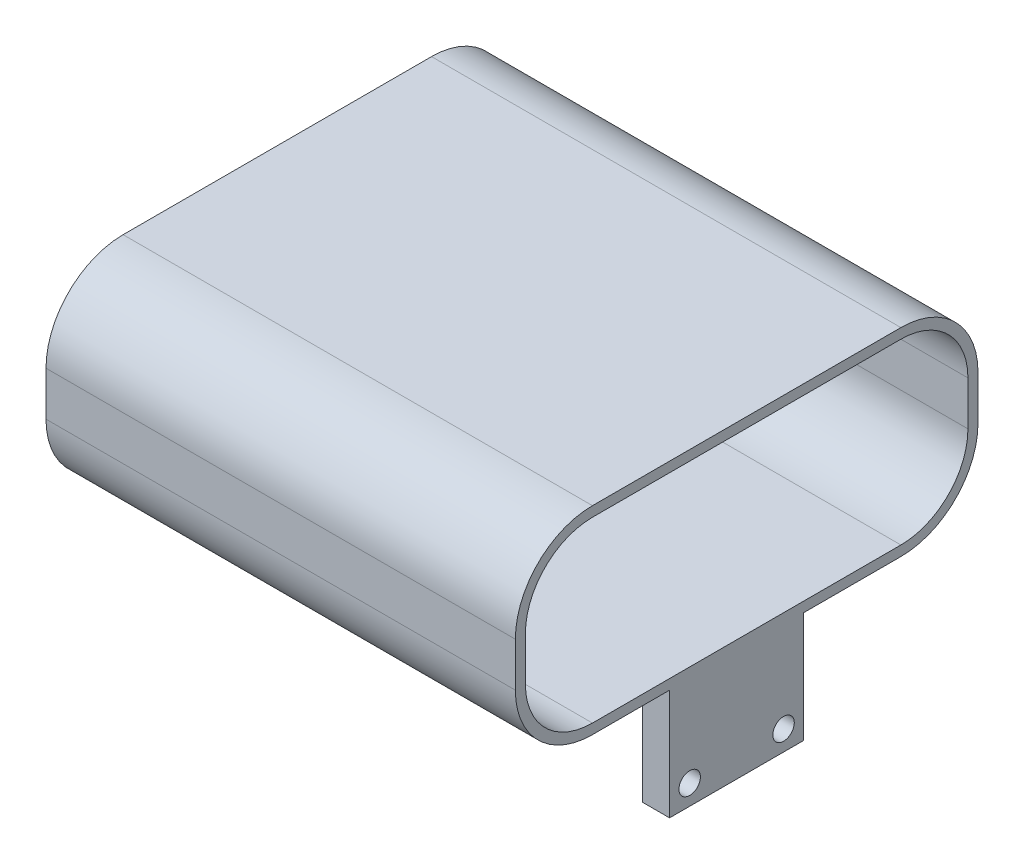
ISO-10303-21;
HEADER;
FILE_DESCRIPTION(('STEP AP214'),'2;1');
FILE_NAME('part.step','',(''),(''),'','','');
FILE_SCHEMA(('AUTOMOTIVE_DESIGN { 1 0 10303 214 1 1 1 1 }'));
ENDSEC;
DATA;
#1=APPLICATION_CONTEXT('core data for automotive mechanical design processes');
#2=APPLICATION_PROTOCOL_DEFINITION('international standard','automotive_design',2000,#1);
#3=PRODUCT_CONTEXT('',#1,'mechanical');
#4=PRODUCT('Part','Part','',(#3));
#5=PRODUCT_RELATED_PRODUCT_CATEGORY('part','',(#4));
#6=PRODUCT_DEFINITION_FORMATION('','',#4);
#7=PRODUCT_DEFINITION_CONTEXT('part definition',#1,'design');
#8=PRODUCT_DEFINITION('design','',#6,#7);
#9=PRODUCT_DEFINITION_SHAPE('','',#8);
#10=(LENGTH_UNIT() NAMED_UNIT(*) SI_UNIT(.MILLI.,.METRE.));
#11=(NAMED_UNIT(*) PLANE_ANGLE_UNIT() SI_UNIT($,.RADIAN.));
#12=(NAMED_UNIT(*) SI_UNIT($,.STERADIAN.) SOLID_ANGLE_UNIT());
#13=UNCERTAINTY_MEASURE_WITH_UNIT(LENGTH_MEASURE(1.E-05),#10,'distance_accuracy_value','');
#14=(GEOMETRIC_REPRESENTATION_CONTEXT(3) GLOBAL_UNCERTAINTY_ASSIGNED_CONTEXT((#13)) GLOBAL_UNIT_ASSIGNED_CONTEXT((#10,
#11,#12)) REPRESENTATION_CONTEXT('',''));
#15=CARTESIAN_POINT('',(0.,0.,0.));
#16=DIRECTION('',(0.,0.,1.));
#17=DIRECTION('',(1.,0.,0.));
#18=AXIS2_PLACEMENT_3D('',#15,#16,#17);
#19=CARTESIAN_POINT('',(35.,7.29134190104978,-22.2726300602498));
#20=DIRECTION('',(-1.,0.,0.));
#21=DIRECTION('',(0.,0.,1.));
#22=AXIS2_PLACEMENT_3D('',#19,#20,#21);
#23=CYLINDRICAL_SURFACE('',#22,11.5);
#24=CARTESIAN_POINT('',(-5.00000000000002,7.29134190104978,-22.2726300602498));
#25=DIRECTION('',(1.,0.,0.));
#26=DIRECTION('',(0.,1.,0.));
#27=AXIS2_PLACEMENT_3D('',#24,#25,#26);
#28=CIRCLE('',#27,11.5);
#29=CARTESIAN_POINT('',(-5.00000000000002,7.29134190104987,-33.7726300602498));
#30=VERTEX_POINT('',#29);
#31=CARTESIAN_POINT('',(-5.00000000000002,-4.20865809895022,-22.2726300602498));
#32=VERTEX_POINT('',#31);
#33=EDGE_CURVE('E224',#30,#32,#28,.F.);
#34=ORIENTED_EDGE('',*,*,#33,.F.);
#35=DIRECTION('',(-1.,0.,0.));
#36=VECTOR('',#35,1.);
#37=CARTESIAN_POINT('',(35.,7.29134190104987,-33.7726300602498));
#38=LINE('',#37,#36);
#39=CARTESIAN_POINT('',(35.,7.29134190104987,-33.7726300602498));
#40=VERTEX_POINT('',#39);
#41=EDGE_CURVE('E232',#40,#30,#38,.T.);
#42=ORIENTED_EDGE('',*,*,#41,.F.);
#43=CARTESIAN_POINT('',(35.,7.29134190104978,-22.2726300602498));
#44=DIRECTION('',(-1.,0.,0.));
#45=DIRECTION('',(0.,0.,1.));
#46=AXIS2_PLACEMENT_3D('',#43,#44,#45);
#47=CIRCLE('',#46,11.5);
#48=CARTESIAN_POINT('',(35.,-4.20865809895022,-22.2726300602497));
#49=VERTEX_POINT('',#48);
#50=EDGE_CURVE('E417',#40,#49,#47,.T.);
#51=ORIENTED_EDGE('',*,*,#50,.T.);
#52=DIRECTION('',(-1.,0.,0.));
#53=VECTOR('',#52,1.);
#54=CARTESIAN_POINT('',(35.,-4.20865809895022,-22.2726300602497));
#55=LINE('',#54,#53);
#56=EDGE_CURVE('E231',#49,#32,#55,.T.);
#57=ORIENTED_EDGE('',*,*,#56,.T.);
#58=EDGE_LOOP('',(#34,#42,#51,#57));
#59=FACE_BOUND('',#58,.T.);
#60=ADVANCED_FACE('F41',(#59),#23,.T.);
#61=CARTESIAN_POINT('',(35.,25.3699847558208,0.));
#62=DIRECTION('',(0.,-1.,0.));
#63=DIRECTION('',(0.,0.,-1.));
#64=AXIS2_PLACEMENT_3D('',#61,#62,#63);
#65=PLANE('',#64);
#66=DIRECTION('',(0.,0.,1.));
#67=VECTOR('',#66,1.);
#68=CARTESIAN_POINT('',(-35.,25.3699847558208,0.));
#69=LINE('',#68,#67);
#70=CARTESIAN_POINT('',(-35.,25.3699847558208,-22.2726300602497));
#71=VERTEX_POINT('',#70);
#72=CARTESIAN_POINT('',(-35.,25.3699847558208,23.7273699397503));
#73=VERTEX_POINT('',#72);
#74=EDGE_CURVE('E278',#71,#73,#69,.T.);
#75=ORIENTED_EDGE('',*,*,#74,.T.);
#76=DIRECTION('',(-1.,0.,0.));
#77=VECTOR('',#76,1.);
#78=CARTESIAN_POINT('',(35.,25.3699847558208,23.7273699397502));
#79=LINE('',#78,#77);
#80=CARTESIAN_POINT('',(35.,25.3699847558208,23.7273699397502));
#81=VERTEX_POINT('',#80);
#82=EDGE_CURVE('E49',#81,#73,#79,.T.);
#83=ORIENTED_EDGE('',*,*,#82,.F.);
#84=DIRECTION('',(0.,0.,1.));
#85=VECTOR('',#84,1.);
#86=CARTESIAN_POINT('',(35.,25.3699847558208,0.));
#87=LINE('',#86,#85);
#88=CARTESIAN_POINT('',(35.,25.3699847558208,-22.2726300602497));
#89=VERTEX_POINT('',#88);
#90=EDGE_CURVE('E410',#89,#81,#87,.T.);
#91=ORIENTED_EDGE('',*,*,#90,.F.);
#92=DIRECTION('',(-1.,0.,0.));
#93=VECTOR('',#92,1.);
#94=CARTESIAN_POINT('',(35.,25.3699847558208,-22.2726300602497));
#95=LINE('',#94,#93);
#96=EDGE_CURVE('E242',#89,#71,#95,.T.);
#97=ORIENTED_EDGE('',*,*,#96,.T.);
#98=EDGE_LOOP('',(#75,#83,#91,#97));
#99=FACE_BOUND('',#98,.T.);
#100=ADVANCED_FACE('F431',(#99),#65,.F.);
#101=CARTESIAN_POINT('',(35.,13.8699847558208,23.7273699397502));
#102=DIRECTION('',(-1.,0.,0.));
#103=DIRECTION('',(0.,0.,1.));
#104=AXIS2_PLACEMENT_3D('',#101,#102,#103);
#105=CYLINDRICAL_SURFACE('',#104,11.5);
#106=CARTESIAN_POINT('',(-35.,13.8699847558208,23.7273699397503));
#107=DIRECTION('',(-1.,0.,0.));
#108=DIRECTION('',(0.,0.,1.));
#109=AXIS2_PLACEMENT_3D('',#106,#107,#108);
#110=CIRCLE('',#109,11.5);
#111=CARTESIAN_POINT('',(-35.,13.8699847558208,35.2273699397503));
#112=VERTEX_POINT('',#111);
#113=EDGE_CURVE('E297',#73,#112,#110,.F.);
#114=ORIENTED_EDGE('',*,*,#113,.T.);
#115=DIRECTION('',(-1.,0.,0.));
#116=VECTOR('',#115,1.);
#117=CARTESIAN_POINT('',(35.,13.8699847558208,35.2273699397502));
#118=LINE('',#117,#116);
#119=CARTESIAN_POINT('',(35.,13.8699847558208,35.2273699397502));
#120=VERTEX_POINT('',#119);
#121=EDGE_CURVE('E302',#120,#112,#118,.T.);
#122=ORIENTED_EDGE('',*,*,#121,.F.);
#123=CARTESIAN_POINT('',(35.,13.8699847558208,23.7273699397502));
#124=DIRECTION('',(-1.,0.,0.));
#125=DIRECTION('',(0.,0.,1.));
#126=AXIS2_PLACEMENT_3D('',#123,#124,#125);
#127=CIRCLE('',#126,11.5);
#128=EDGE_CURVE('E265',#81,#120,#127,.F.);
#129=ORIENTED_EDGE('',*,*,#128,.F.);
#130=ORIENTED_EDGE('',*,*,#82,.T.);
#131=EDGE_LOOP('',(#114,#122,#129,#130));
#132=FACE_BOUND('',#131,.T.);
#133=ADVANCED_FACE('F428',(#132),#105,.T.);
#134=CARTESIAN_POINT('',(35.,0.,35.2273699397503));
#135=DIRECTION('',(0.,0.,-1.));
#136=DIRECTION('',(0.,1.,0.));
#137=AXIS2_PLACEMENT_3D('',#134,#135,#136);
#138=PLANE('',#137);
#139=DIRECTION('',(0.,-1.,0.));
#140=VECTOR('',#139,1.);
#141=CARTESIAN_POINT('',(-35.,0.,35.2273699397503));
#142=LINE('',#141,#140);
#143=CARTESIAN_POINT('',(-35.,7.29134190104978,35.2273699397503));
#144=VERTEX_POINT('',#143);
#145=EDGE_CURVE('E294',#112,#144,#142,.T.);
#146=ORIENTED_EDGE('',*,*,#145,.T.);
#147=DIRECTION('',(-1.,0.,0.));
#148=VECTOR('',#147,1.);
#149=CARTESIAN_POINT('',(35.,7.29134190104978,35.2273699397502));
#150=LINE('',#149,#148);
#151=CARTESIAN_POINT('',(35.,7.29134190104978,35.2273699397502));
#152=VERTEX_POINT('',#151);
#153=EDGE_CURVE('E304',#152,#144,#150,.T.);
#154=ORIENTED_EDGE('',*,*,#153,.F.);
#155=DIRECTION('',(0.,-1.,0.));
#156=VECTOR('',#155,1.);
#157=CARTESIAN_POINT('',(35.,0.,35.2273699397503));
#158=LINE('',#157,#156);
#159=EDGE_CURVE('E269',#120,#152,#158,.T.);
#160=ORIENTED_EDGE('',*,*,#159,.F.);
#161=ORIENTED_EDGE('',*,*,#121,.T.);
#162=EDGE_LOOP('',(#146,#154,#160,#161));
#163=FACE_BOUND('',#162,.T.);
#164=ADVANCED_FACE('F425',(#163),#138,.F.);
#165=CARTESIAN_POINT('',(35.,7.29134190104978,23.7273699397502));
#166=DIRECTION('',(-1.,0.,0.));
#167=DIRECTION('',(0.,0.,1.));
#168=AXIS2_PLACEMENT_3D('',#165,#166,#167);
#169=CYLINDRICAL_SURFACE('',#168,11.5);
#170=CARTESIAN_POINT('',(-35.,7.29134190104978,23.7273699397503));
#171=DIRECTION('',(-1.,0.,0.));
#172=DIRECTION('',(0.,0.,1.));
#173=AXIS2_PLACEMENT_3D('',#170,#171,#172);
#174=CIRCLE('',#173,11.5);
#175=CARTESIAN_POINT('',(-35.,-4.20865809895022,23.7273699397503));
#176=VERTEX_POINT('',#175);
#177=EDGE_CURVE('E291',#176,#144,#174,.T.);
#178=ORIENTED_EDGE('',*,*,#177,.F.);
#179=DIRECTION('',(-1.,0.,0.));
#180=VECTOR('',#179,1.);
#181=CARTESIAN_POINT('',(35.,-4.20865809895022,23.7273699397502));
#182=LINE('',#181,#180);
#183=CARTESIAN_POINT('',(35.,-4.20865809895022,23.7273699397502));
#184=VERTEX_POINT('',#183);
#185=EDGE_CURVE('E234',#184,#176,#182,.T.);
#186=ORIENTED_EDGE('',*,*,#185,.F.);
#187=CARTESIAN_POINT('',(35.,7.29134190104978,23.7273699397502));
#188=DIRECTION('',(-1.,0.,0.));
#189=DIRECTION('',(0.,0.,1.));
#190=AXIS2_PLACEMENT_3D('',#187,#188,#189);
#191=CIRCLE('',#190,11.5);
#192=EDGE_CURVE('E274',#184,#152,#191,.T.);
#193=ORIENTED_EDGE('',*,*,#192,.T.);
#194=ORIENTED_EDGE('',*,*,#153,.T.);
#195=EDGE_LOOP('',(#178,#186,#193,#194));
#196=FACE_BOUND('',#195,.T.);
#197=ADVANCED_FACE('F313',(#196),#169,.T.);
#198=CARTESIAN_POINT('',(35.,-4.20865809895022,0.));
#199=DIRECTION('',(0.,-1.,0.));
#200=DIRECTION('',(0.,0.,-1.));
#201=AXIS2_PLACEMENT_3D('',#198,#199,#200);
#202=PLANE('',#201);
#203=DIRECTION('',(1.,0.,0.));
#204=VECTOR('',#203,1.);
#205=CARTESIAN_POINT('',(35.,-4.20865809895022,-7.77263006024976));
#206=LINE('',#205,#204);
#207=CARTESIAN_POINT('',(31.,-4.20865809895022,-7.77263006024977));
#208=VERTEX_POINT('',#207);
#209=CARTESIAN_POINT('',(35.,-4.20865809895022,-7.77263006024976));
#210=VERTEX_POINT('',#209);
#211=EDGE_CURVE('E64',#208,#210,#206,.T.);
#212=ORIENTED_EDGE('',*,*,#211,.F.);
#213=DIRECTION('',(0.,0.,-1.));
#214=VECTOR('',#213,1.);
#215=CARTESIAN_POINT('',(31.,-4.20865809895022,0.));
#216=LINE('',#215,#214);
#217=CARTESIAN_POINT('',(31.,-4.20865809895022,12.2273699397502));
#218=VERTEX_POINT('',#217);
#219=EDGE_CURVE('E373',#218,#208,#216,.T.);
#220=ORIENTED_EDGE('',*,*,#219,.F.);
#221=DIRECTION('',(-1.,0.,0.));
#222=VECTOR('',#221,1.);
#223=CARTESIAN_POINT('',(35.,-4.20865809895022,12.2273699397502));
#224=LINE('',#223,#222);
#225=CARTESIAN_POINT('',(35.,-4.20865809895022,12.2273699397502));
#226=VERTEX_POINT('',#225);
#227=EDGE_CURVE('E367',#226,#218,#224,.T.);
#228=ORIENTED_EDGE('',*,*,#227,.F.);
#229=DIRECTION('',(0.,0.,1.));
#230=VECTOR('',#229,1.);
#231=CARTESIAN_POINT('',(35.,-4.20865809895022,0.));
#232=LINE('',#231,#230);
#233=EDGE_CURVE('E311',#226,#184,#232,.T.);
#234=ORIENTED_EDGE('',*,*,#233,.T.);
#235=ORIENTED_EDGE('',*,*,#185,.T.);
#236=DIRECTION('',(0.,0.,1.));
#237=VECTOR('',#236,1.);
#238=CARTESIAN_POINT('',(-35.,-4.20865809895022,0.));
#239=LINE('',#238,#237);
#240=CARTESIAN_POINT('',(-35.,-4.20865809895022,-22.2726300602497));
#241=VERTEX_POINT('',#240);
#242=EDGE_CURVE('E229',#241,#176,#239,.T.);
#243=ORIENTED_EDGE('',*,*,#242,.F.);
#244=CARTESIAN_POINT('',(-33.,-4.20865809895022,-22.2726300602497));
#245=VERTEX_POINT('',#244);
#246=EDGE_CURVE('E220',#245,#241,#55,.T.);
#247=ORIENTED_EDGE('',*,*,#246,.F.);
#248=DIRECTION('',(1.,0.,0.));
#249=VECTOR('',#248,1.);
#250=CARTESIAN_POINT('',(0.,-4.20865809895022,-22.2726300602498));
#251=LINE('',#250,#249);
#252=EDGE_CURVE('E197',#245,#32,#251,.T.);
#253=ORIENTED_EDGE('',*,*,#252,.T.);
#254=ORIENTED_EDGE('',*,*,#56,.F.);
#255=EDGE_CURVE('E420',#49,#210,#232,.T.);
#256=ORIENTED_EDGE('',*,*,#255,.T.);
#257=EDGE_LOOP('',(#212,#220,#228,#234,#235,#243,#247,#253,#254,#256));
#258=FACE_BOUND('',#257,.T.);
#259=ADVANCED_FACE('F227',(#258),#202,.T.);
#260=CARTESIAN_POINT('',(-33.,7.29134190104978,-22.2726300602497));
#261=DIRECTION('',(-1.,0.,0.));
#262=DIRECTION('',(0.,0.,1.));
#263=AXIS2_PLACEMENT_3D('',#260,#261,#262);
#264=CIRCLE('',#263,11.5);
#265=CARTESIAN_POINT('',(-33.,7.29134190104987,-33.7726300602497));
#266=VERTEX_POINT('',#265);
#267=EDGE_CURVE('E212',#245,#266,#264,.F.);
#268=ORIENTED_EDGE('',*,*,#267,.F.);
#269=ORIENTED_EDGE('',*,*,#246,.T.);
#270=CARTESIAN_POINT('',(-35.,7.29134190104978,-22.2726300602497));
#271=DIRECTION('',(-1.,0.,0.));
#272=DIRECTION('',(0.,0.,1.));
#273=AXIS2_PLACEMENT_3D('',#270,#271,#272);
#274=CIRCLE('',#273,11.5);
#275=CARTESIAN_POINT('',(-35.,7.29134190104987,-33.7726300602497));
#276=VERTEX_POINT('',#275);
#277=EDGE_CURVE('E288',#276,#241,#274,.T.);
#278=ORIENTED_EDGE('',*,*,#277,.F.);
#279=EDGE_CURVE('E222',#266,#276,#38,.T.);
#280=ORIENTED_EDGE('',*,*,#279,.F.);
#281=EDGE_LOOP('',(#268,#269,#278,#280));
#282=FACE_BOUND('',#281,.T.);
#283=ADVANCED_FACE('F218',(#282),#23,.T.);
#284=CARTESIAN_POINT('',(35.,0.,-33.7726300602498));
#285=DIRECTION('',(0.,0.,-1.));
#286=DIRECTION('',(-1.,0.,0.));
#287=AXIS2_PLACEMENT_3D('',#284,#285,#286);
#288=PLANE('',#287);
#289=DIRECTION('',(0.,-1.,0.));
#290=VECTOR('',#289,1.);
#291=CARTESIAN_POINT('',(-35.,0.,-33.7726300602497));
#292=LINE('',#291,#290);
#293=CARTESIAN_POINT('',(-35.,13.8699847558208,-33.7726300602497));
#294=VERTEX_POINT('',#293);
#295=EDGE_CURVE('E285',#294,#276,#292,.T.);
#296=ORIENTED_EDGE('',*,*,#295,.F.);
#297=DIRECTION('',(-1.,0.,0.));
#298=VECTOR('',#297,1.);
#299=CARTESIAN_POINT('',(35.,13.8699847558208,-33.7726300602498));
#300=LINE('',#299,#298);
#301=CARTESIAN_POINT('',(35.,13.8699847558208,-33.7726300602498));
#302=VERTEX_POINT('',#301);
#303=EDGE_CURVE('E240',#302,#294,#300,.T.);
#304=ORIENTED_EDGE('',*,*,#303,.F.);
#305=DIRECTION('',(0.,-1.,0.));
#306=VECTOR('',#305,1.);
#307=CARTESIAN_POINT('',(35.,0.,-33.7726300602498));
#308=LINE('',#307,#306);
#309=EDGE_CURVE('E415',#302,#40,#308,.T.);
#310=ORIENTED_EDGE('',*,*,#309,.T.);
#311=ORIENTED_EDGE('',*,*,#41,.T.);
#312=DIRECTION('',(-1.,0.,0.));
#313=VECTOR('',#312,1.);
#314=CARTESIAN_POINT('',(0.,7.29134190104987,-33.7726300602498));
#315=LINE('',#314,#313);
#316=EDGE_CURVE('E206',#30,#266,#315,.T.);
#317=ORIENTED_EDGE('',*,*,#316,.T.);
#318=ORIENTED_EDGE('',*,*,#279,.T.);
#319=EDGE_LOOP('',(#296,#304,#310,#311,#317,#318));
#320=FACE_BOUND('',#319,.T.);
#321=ADVANCED_FACE('F321',(#320),#288,.T.);
#322=CARTESIAN_POINT('',(35.,13.8699847558208,-22.2726300602498));
#323=DIRECTION('',(-1.,0.,0.));
#324=DIRECTION('',(0.,0.,1.));
#325=AXIS2_PLACEMENT_3D('',#322,#323,#324);
#326=CYLINDRICAL_SURFACE('',#325,10.);
#327=DIRECTION('',(-1.,0.,0.));
#328=VECTOR('',#327,1.);
#329=CARTESIAN_POINT('',(35.,23.8699847558208,-22.2726300602497));
#330=LINE('',#329,#328);
#331=CARTESIAN_POINT('',(35.,23.8699847558208,-22.2726300602497));
#332=VERTEX_POINT('',#331);
#333=CARTESIAN_POINT('',(-33.,23.8699847558208,-22.2726300602497));
#334=VERTEX_POINT('',#333);
#335=EDGE_CURVE('E263',#332,#334,#330,.T.);
#336=ORIENTED_EDGE('',*,*,#335,.T.);
#337=CARTESIAN_POINT('',(-33.,13.8699847558208,-22.2726300602497));
#338=DIRECTION('',(-1.,0.,0.));
#339=DIRECTION('',(0.,0.,1.));
#340=AXIS2_PLACEMENT_3D('',#337,#338,#339);
#341=CIRCLE('',#340,10.);
#342=CARTESIAN_POINT('',(-33.,13.8699847558208,-32.2726300602497));
#343=VERTEX_POINT('',#342);
#344=EDGE_CURVE('E282',#334,#343,#341,.T.);
#345=ORIENTED_EDGE('',*,*,#344,.T.);
#346=DIRECTION('',(-1.,0.,0.));
#347=VECTOR('',#346,1.);
#348=CARTESIAN_POINT('',(35.,13.8699847558208,-32.2726300602498));
#349=LINE('',#348,#347);
#350=CARTESIAN_POINT('',(35.,13.8699847558208,-32.2726300602498));
#351=VERTEX_POINT('',#350);
#352=EDGE_CURVE('E244',#351,#343,#349,.T.);
#353=ORIENTED_EDGE('',*,*,#352,.F.);
#354=CARTESIAN_POINT('',(35.,13.8699847558208,-22.2726300602498));
#355=DIRECTION('',(-1.,0.,0.));
#356=DIRECTION('',(0.,0.,1.));
#357=AXIS2_PLACEMENT_3D('',#354,#355,#356);
#358=CIRCLE('',#357,10.);
#359=EDGE_CURVE('E299',#332,#351,#358,.T.);
#360=ORIENTED_EDGE('',*,*,#359,.F.);
#361=EDGE_LOOP('',(#336,#345,#353,#360));
#362=FACE_BOUND('',#361,.T.);
#363=ADVANCED_FACE('F43',(#362),#326,.F.);
#364=CARTESIAN_POINT('',(35.,0.,-32.2726300602498));
#365=DIRECTION('',(0.,0.,-1.));
#366=DIRECTION('',(-1.,0.,0.));
#367=AXIS2_PLACEMENT_3D('',#364,#365,#366);
#368=PLANE('',#367);
#369=ORIENTED_EDGE('',*,*,#352,.T.);
#370=DIRECTION('',(0.,-1.,0.));
#371=VECTOR('',#370,1.);
#372=CARTESIAN_POINT('',(-33.,13.8699847558208,-32.2726300602497));
#373=LINE('',#372,#371);
#374=CARTESIAN_POINT('',(-33.,7.29134190104987,-32.2726300602497));
#375=VERTEX_POINT('',#374);
#376=EDGE_CURVE('E387',#343,#375,#373,.T.);
#377=ORIENTED_EDGE('',*,*,#376,.T.);
#378=DIRECTION('',(-1.,0.,0.));
#379=VECTOR('',#378,1.);
#380=CARTESIAN_POINT('',(35.,7.29134190104987,-32.2726300602498));
#381=LINE('',#380,#379);
#382=CARTESIAN_POINT('',(-5.00000000000002,7.29134190104987,-32.2726300602497));
#383=VERTEX_POINT('',#382);
#384=EDGE_CURVE('E225',#383,#375,#381,.T.);
#385=ORIENTED_EDGE('',*,*,#384,.F.);
#386=DIRECTION('',(-1.,0.,0.));
#387=VECTOR('',#386,1.);
#388=CARTESIAN_POINT('',(35.,7.29134190104985,-32.2726300602498));
#389=LINE('',#388,#387);
#390=CARTESIAN_POINT('',(35.,7.29134190104985,-32.2726300602498));
#391=VERTEX_POINT('',#390);
#392=EDGE_CURVE('E247',#391,#383,#389,.T.);
#393=ORIENTED_EDGE('',*,*,#392,.F.);
#394=DIRECTION('',(0.,-1.,0.));
#395=VECTOR('',#394,1.);
#396=CARTESIAN_POINT('',(35.,0.,-32.2726300602498));
#397=LINE('',#396,#395);
#398=EDGE_CURVE('E408',#351,#391,#397,.T.);
#399=ORIENTED_EDGE('',*,*,#398,.F.);
#400=EDGE_LOOP('',(#369,#377,#385,#393,#399));
#401=FACE_BOUND('',#400,.T.);
#402=ADVANCED_FACE('F444',(#401),#368,.F.);
#403=CARTESIAN_POINT('',(35.,7.29134190104978,-22.2726300602498));
#404=DIRECTION('',(-1.,0.,0.));
#405=DIRECTION('',(0.,0.,1.));
#406=AXIS2_PLACEMENT_3D('',#403,#404,#405);
#407=CYLINDRICAL_SURFACE('',#406,10.);
#408=ORIENTED_EDGE('',*,*,#392,.T.);
#409=CARTESIAN_POINT('',(-5.00000000000002,7.29134190104978,-22.2726300602498));
#410=DIRECTION('',(1.,0.,0.));
#411=DIRECTION('',(0.,1.,0.));
#412=AXIS2_PLACEMENT_3D('',#409,#410,#411);
#413=CIRCLE('',#412,10.);
#414=CARTESIAN_POINT('',(-5.00000000000002,-2.70865809895022,-22.2726300602498));
#415=VERTEX_POINT('',#414);
#416=EDGE_CURVE('E11',#383,#415,#413,.F.);
#417=ORIENTED_EDGE('',*,*,#416,.T.);
#418=DIRECTION('',(-1.,0.,0.));
#419=VECTOR('',#418,1.);
#420=CARTESIAN_POINT('',(35.,-2.70865809895022,-22.2726300602497));
#421=LINE('',#420,#419);
#422=CARTESIAN_POINT('',(35.,-2.70865809895022,-22.2726300602497));
#423=VERTEX_POINT('',#422);
#424=EDGE_CURVE('E250',#423,#415,#421,.T.);
#425=ORIENTED_EDGE('',*,*,#424,.F.);
#426=CARTESIAN_POINT('',(35.,7.29134190104978,-22.2726300602498));
#427=DIRECTION('',(-1.,0.,0.));
#428=DIRECTION('',(0.,0.,1.));
#429=AXIS2_PLACEMENT_3D('',#426,#427,#428);
#430=CIRCLE('',#429,10.);
#431=EDGE_CURVE('E406',#391,#423,#430,.T.);
#432=ORIENTED_EDGE('',*,*,#431,.F.);
#433=EDGE_LOOP('',(#408,#417,#425,#432));
#434=FACE_BOUND('',#433,.T.);
#435=ADVANCED_FACE('F448',(#434),#407,.F.);
#436=CARTESIAN_POINT('',(35.,-2.70865809895022,0.));
#437=DIRECTION('',(0.,-1.,0.));
#438=DIRECTION('',(0.,0.,-1.));
#439=AXIS2_PLACEMENT_3D('',#436,#437,#438);
#440=PLANE('',#439);
#441=DIRECTION('',(-1.,0.,0.));
#442=VECTOR('',#441,1.);
#443=CARTESIAN_POINT('',(35.,-2.70865809895022,23.7273699397502));
#444=LINE('',#443,#442);
#445=CARTESIAN_POINT('',(35.,-2.70865809895022,23.7273699397502));
#446=VERTEX_POINT('',#445);
#447=CARTESIAN_POINT('',(-33.,-2.70865809895022,23.7273699397503));
#448=VERTEX_POINT('',#447);
#449=EDGE_CURVE('E253',#446,#448,#444,.T.);
#450=ORIENTED_EDGE('',*,*,#449,.F.);
#451=DIRECTION('',(0.,0.,1.));
#452=VECTOR('',#451,1.);
#453=CARTESIAN_POINT('',(35.,-2.70865809895022,0.));
#454=LINE('',#453,#452);
#455=EDGE_CURVE('E404',#423,#446,#454,.T.);
#456=ORIENTED_EDGE('',*,*,#455,.F.);
#457=ORIENTED_EDGE('',*,*,#424,.T.);
#458=DIRECTION('',(1.,0.,0.));
#459=VECTOR('',#458,1.);
#460=CARTESIAN_POINT('',(35.,-2.70865809895022,-22.2726300602498));
#461=LINE('',#460,#459);
#462=CARTESIAN_POINT('',(-33.,-2.70865809895022,-22.2726300602497));
#463=VERTEX_POINT('',#462);
#464=EDGE_CURVE('E331',#463,#415,#461,.T.);
#465=ORIENTED_EDGE('',*,*,#464,.F.);
#466=DIRECTION('',(0.,0.,1.));
#467=VECTOR('',#466,1.);
#468=CARTESIAN_POINT('',(-33.,-2.70865809895022,-22.2726300602497));
#469=LINE('',#468,#467);
#470=EDGE_CURVE('E215',#463,#448,#469,.T.);
#471=ORIENTED_EDGE('',*,*,#470,.T.);
#472=EDGE_LOOP('',(#450,#456,#457,#465,#471));
#473=FACE_BOUND('',#472,.T.);
#474=ADVANCED_FACE('F541',(#473),#440,.F.);
#475=CARTESIAN_POINT('',(35.,7.29134190104978,23.7273699397502));
#476=DIRECTION('',(-1.,0.,0.));
#477=DIRECTION('',(0.,0.,1.));
#478=AXIS2_PLACEMENT_3D('',#475,#476,#477);
#479=CYLINDRICAL_SURFACE('',#478,10.);
#480=ORIENTED_EDGE('',*,*,#449,.T.);
#481=CARTESIAN_POINT('',(-33.,7.29134190104978,23.7273699397503));
#482=DIRECTION('',(-1.,0.,0.));
#483=DIRECTION('',(0.,0.,1.));
#484=AXIS2_PLACEMENT_3D('',#481,#482,#483);
#485=CIRCLE('',#484,10.);
#486=CARTESIAN_POINT('',(-33.,7.29134190104978,33.7273699397503));
#487=VERTEX_POINT('',#486);
#488=EDGE_CURVE('E384',#448,#487,#485,.T.);
#489=ORIENTED_EDGE('',*,*,#488,.T.);
#490=DIRECTION('',(-1.,0.,0.));
#491=VECTOR('',#490,1.);
#492=CARTESIAN_POINT('',(35.,7.29134190104978,33.7273699397502));
#493=LINE('',#492,#491);
#494=CARTESIAN_POINT('',(35.,7.29134190104978,33.7273699397502));
#495=VERTEX_POINT('',#494);
#496=EDGE_CURVE('E256',#495,#487,#493,.T.);
#497=ORIENTED_EDGE('',*,*,#496,.F.);
#498=CARTESIAN_POINT('',(35.,7.29134190104978,23.7273699397502));
#499=DIRECTION('',(-1.,0.,0.));
#500=DIRECTION('',(0.,0.,1.));
#501=AXIS2_PLACEMENT_3D('',#498,#499,#500);
#502=CIRCLE('',#501,10.);
#503=EDGE_CURVE('E402',#446,#495,#502,.T.);
#504=ORIENTED_EDGE('',*,*,#503,.F.);
#505=EDGE_LOOP('',(#480,#489,#497,#504));
#506=FACE_BOUND('',#505,.T.);
#507=ADVANCED_FACE('F545',(#506),#479,.F.);
#508=CARTESIAN_POINT('',(35.,0.,33.7273699397502));
#509=DIRECTION('',(0.,0.,-1.));
#510=DIRECTION('',(-1.,0.,0.));
#511=AXIS2_PLACEMENT_3D('',#508,#509,#510);
#512=PLANE('',#511);
#513=DIRECTION('',(0.,-1.,0.));
#514=VECTOR('',#513,1.);
#515=CARTESIAN_POINT('',(-33.,13.8699847558208,33.7273699397503));
#516=LINE('',#515,#514);
#517=CARTESIAN_POINT('',(-33.,13.8699847558208,33.7273699397503));
#518=VERTEX_POINT('',#517);
#519=EDGE_CURVE('E381',#518,#487,#516,.T.);
#520=ORIENTED_EDGE('',*,*,#519,.F.);
#521=DIRECTION('',(-1.,0.,0.));
#522=VECTOR('',#521,1.);
#523=CARTESIAN_POINT('',(35.,13.8699847558208,33.7273699397502));
#524=LINE('',#523,#522);
#525=CARTESIAN_POINT('',(35.,13.8699847558208,33.7273699397502));
#526=VERTEX_POINT('',#525);
#527=EDGE_CURVE('E259',#526,#518,#524,.T.);
#528=ORIENTED_EDGE('',*,*,#527,.F.);
#529=DIRECTION('',(0.,-1.,0.));
#530=VECTOR('',#529,1.);
#531=CARTESIAN_POINT('',(35.,0.,33.7273699397502));
#532=LINE('',#531,#530);
#533=EDGE_CURVE('E399',#526,#495,#532,.T.);
#534=ORIENTED_EDGE('',*,*,#533,.T.);
#535=ORIENTED_EDGE('',*,*,#496,.T.);
#536=EDGE_LOOP('',(#520,#528,#534,#535));
#537=FACE_BOUND('',#536,.T.);
#538=ADVANCED_FACE('F582',(#537),#512,.T.);
#539=CARTESIAN_POINT('',(35.,13.8699847558208,23.7273699397502));
#540=DIRECTION('',(-1.,0.,0.));
#541=DIRECTION('',(0.,0.,1.));
#542=AXIS2_PLACEMENT_3D('',#539,#540,#541);
#543=CYLINDRICAL_SURFACE('',#542,10.);
#544=CARTESIAN_POINT('',(-33.,13.8699847558208,23.7273699397503));
#545=DIRECTION('',(1.,0.,0.));
#546=DIRECTION('',(0.,0.,-1.));
#547=AXIS2_PLACEMENT_3D('',#544,#545,#546);
#548=CIRCLE('',#547,10.);
#549=CARTESIAN_POINT('',(-33.,23.8699847558208,23.7273699397503));
#550=VERTEX_POINT('',#549);
#551=EDGE_CURVE('E378',#550,#518,#548,.T.);
#552=ORIENTED_EDGE('',*,*,#551,.F.);
#553=DIRECTION('',(-1.,0.,0.));
#554=VECTOR('',#553,1.);
#555=CARTESIAN_POINT('',(35.,23.8699847558208,23.7273699397502));
#556=LINE('',#555,#554);
#557=CARTESIAN_POINT('',(35.,23.8699847558208,23.7273699397502));
#558=VERTEX_POINT('',#557);
#559=EDGE_CURVE('E262',#558,#550,#556,.T.);
#560=ORIENTED_EDGE('',*,*,#559,.F.);
#561=CARTESIAN_POINT('',(35.,13.8699847558208,23.7273699397502));
#562=DIRECTION('',(-1.,0.,0.));
#563=DIRECTION('',(0.,0.,1.));
#564=AXIS2_PLACEMENT_3D('',#561,#562,#563);
#565=CIRCLE('',#564,10.);
#566=EDGE_CURVE('E396',#558,#526,#565,.F.);
#567=ORIENTED_EDGE('',*,*,#566,.T.);
#568=ORIENTED_EDGE('',*,*,#527,.T.);
#569=EDGE_LOOP('',(#552,#560,#567,#568));
#570=FACE_BOUND('',#569,.T.);
#571=ADVANCED_FACE('F591',(#570),#543,.F.);
#572=CARTESIAN_POINT('',(35.,23.8699847558208,0.));
#573=DIRECTION('',(0.,-1.,0.));
#574=DIRECTION('',(0.,0.,-1.));
#575=AXIS2_PLACEMENT_3D('',#572,#573,#574);
#576=PLANE('',#575);
#577=DIRECTION('',(0.,0.,1.));
#578=VECTOR('',#577,1.);
#579=CARTESIAN_POINT('',(-33.,23.8699847558208,-22.2726300602497));
#580=LINE('',#579,#578);
#581=EDGE_CURVE('E375',#334,#550,#580,.T.);
#582=ORIENTED_EDGE('',*,*,#581,.F.);
#583=ORIENTED_EDGE('',*,*,#335,.F.);
#584=DIRECTION('',(0.,0.,1.));
#585=VECTOR('',#584,1.);
#586=CARTESIAN_POINT('',(35.,23.8699847558208,0.));
#587=LINE('',#586,#585);
#588=EDGE_CURVE('E393',#332,#558,#587,.T.);
#589=ORIENTED_EDGE('',*,*,#588,.T.);
#590=ORIENTED_EDGE('',*,*,#559,.T.);
#591=EDGE_LOOP('',(#582,#583,#589,#590));
#592=FACE_BOUND('',#591,.T.);
#593=ADVANCED_FACE('F600',(#592),#576,.T.);
#594=CARTESIAN_POINT('',(35.,13.8699847558208,-22.2726300602498));
#595=DIRECTION('',(-1.,0.,0.));
#596=DIRECTION('',(0.,0.,1.));
#597=AXIS2_PLACEMENT_3D('',#594,#595,#596);
#598=CYLINDRICAL_SURFACE('',#597,11.5);
#599=CARTESIAN_POINT('',(-35.,13.8699847558208,-22.2726300602497));
#600=DIRECTION('',(-1.,0.,0.));
#601=DIRECTION('',(0.,0.,1.));
#602=AXIS2_PLACEMENT_3D('',#599,#600,#601);
#603=CIRCLE('',#602,11.5);
#604=EDGE_CURVE('E281',#71,#294,#603,.T.);
#605=ORIENTED_EDGE('',*,*,#604,.F.);
#606=ORIENTED_EDGE('',*,*,#96,.F.);
#607=CARTESIAN_POINT('',(35.,13.8699847558208,-22.2726300602498));
#608=DIRECTION('',(-1.,0.,0.));
#609=DIRECTION('',(0.,0.,1.));
#610=AXIS2_PLACEMENT_3D('',#607,#608,#609);
#611=CIRCLE('',#610,11.5);
#612=EDGE_CURVE('E412',#89,#302,#611,.T.);
#613=ORIENTED_EDGE('',*,*,#612,.T.);
#614=ORIENTED_EDGE('',*,*,#303,.T.);
#615=EDGE_LOOP('',(#605,#606,#613,#614));
#616=FACE_BOUND('',#615,.T.);
#617=ADVANCED_FACE('F434',(#616),#598,.T.);
#618=CARTESIAN_POINT('',(35.,0.,0.));
#619=DIRECTION('',(-1.,0.,0.));
#620=DIRECTION('',(0.,0.,1.));
#621=AXIS2_PLACEMENT_3D('',#618,#619,#620);
#622=PLANE('',#621);
#623=ORIENTED_EDGE('',*,*,#233,.F.);
#624=DIRECTION('',(0.,-1.,0.));
#625=VECTOR('',#624,1.);
#626=CARTESIAN_POINT('',(35.,-2.70865809895022,12.2273699397502));
#627=LINE('',#626,#625);
#628=CARTESIAN_POINT('',(35.,-20.7086580989501,12.2273699397502));
#629=VERTEX_POINT('',#628);
#630=EDGE_CURVE('E361',#226,#629,#627,.T.);
#631=ORIENTED_EDGE('',*,*,#630,.T.);
#632=DIRECTION('',(0.,0.,-1.));
#633=VECTOR('',#632,1.);
#634=CARTESIAN_POINT('',(35.,-20.7086580989501,-7.77263006024977));
#635=LINE('',#634,#633);
#636=CARTESIAN_POINT('',(35.,-20.7086580989501,-7.77263006024977));
#637=VERTEX_POINT('',#636);
#638=EDGE_CURVE('E353',#629,#637,#635,.T.);
#639=ORIENTED_EDGE('',*,*,#638,.T.);
#640=DIRECTION('',(0.,1.,0.));
#641=VECTOR('',#640,1.);
#642=CARTESIAN_POINT('',(35.,-2.70865809895022,-7.77263006024976));
#643=LINE('',#642,#641);
#644=EDGE_CURVE('E346',#637,#210,#643,.T.);
#645=ORIENTED_EDGE('',*,*,#644,.T.);
#646=ORIENTED_EDGE('',*,*,#255,.F.);
#647=ORIENTED_EDGE('',*,*,#50,.F.);
#648=ORIENTED_EDGE('',*,*,#309,.F.);
#649=ORIENTED_EDGE('',*,*,#612,.F.);
#650=ORIENTED_EDGE('',*,*,#90,.T.);
#651=ORIENTED_EDGE('',*,*,#128,.T.);
#652=ORIENTED_EDGE('',*,*,#159,.T.);
#653=ORIENTED_EDGE('',*,*,#192,.F.);
#654=EDGE_LOOP('',(#623,#631,#639,#645,#646,#647,#648,#649,#650,#651,#652,#653));
#655=FACE_BOUND('',#654,.T.);
#656=ORIENTED_EDGE('',*,*,#455,.T.);
#657=ORIENTED_EDGE('',*,*,#503,.T.);
#658=ORIENTED_EDGE('',*,*,#533,.F.);
#659=ORIENTED_EDGE('',*,*,#566,.F.);
#660=ORIENTED_EDGE('',*,*,#588,.F.);
#661=ORIENTED_EDGE('',*,*,#359,.T.);
#662=ORIENTED_EDGE('',*,*,#398,.T.);
#663=ORIENTED_EDGE('',*,*,#431,.T.);
#664=EDGE_LOOP('',(#656,#657,#658,#659,#660,#661,#662,#663));
#665=FACE_BOUND('',#664,.T.);
#666=CARTESIAN_POINT('',(35.,-17.7086580989501,9.22736993975023));
#667=DIRECTION('',(1.,0.,0.));
#668=DIRECTION('',(0.,0.,-1.));
#669=AXIS2_PLACEMENT_3D('',#666,#667,#668);
#670=CIRCLE('',#669,1.6);
#671=CARTESIAN_POINT('',(35.,-17.7086580989501,7.62736993975023));
#672=VERTEX_POINT('',#671);
#673=EDGE_CURVE('E336',#672,#672,#670,.T.);
#674=ORIENTED_EDGE('',*,*,#673,.F.);
#675=EDGE_LOOP('',(#674));
#676=FACE_BOUND('',#675,.T.);
#677=CARTESIAN_POINT('',(35.,-17.7086580989501,-4.77263006024977));
#678=DIRECTION('',(1.,0.,0.));
#679=DIRECTION('',(0.,0.,-1.));
#680=AXIS2_PLACEMENT_3D('',#677,#678,#679);
#681=CIRCLE('',#680,1.6);
#682=CARTESIAN_POINT('',(35.,-17.7086580989501,-6.37263006024977));
#683=VERTEX_POINT('',#682);
#684=EDGE_CURVE('E340',#683,#683,#681,.T.);
#685=ORIENTED_EDGE('',*,*,#684,.F.);
#686=EDGE_LOOP('',(#685));
#687=FACE_BOUND('',#686,.T.);
#688=ADVANCED_FACE('F421',(#655,#665,#676,#687),#622,.F.);
#689=CARTESIAN_POINT('',(-35.,0.,0.));
#690=DIRECTION('',(-1.,0.,0.));
#691=DIRECTION('',(0.,0.,1.));
#692=AXIS2_PLACEMENT_3D('',#689,#690,#691);
#693=PLANE('',#692);
#694=ORIENTED_EDGE('',*,*,#74,.F.);
#695=ORIENTED_EDGE('',*,*,#604,.T.);
#696=ORIENTED_EDGE('',*,*,#295,.T.);
#697=ORIENTED_EDGE('',*,*,#277,.T.);
#698=ORIENTED_EDGE('',*,*,#242,.T.);
#699=ORIENTED_EDGE('',*,*,#177,.T.);
#700=ORIENTED_EDGE('',*,*,#145,.F.);
#701=ORIENTED_EDGE('',*,*,#113,.F.);
#702=EDGE_LOOP('',(#694,#695,#696,#697,#698,#699,#700,#701));
#703=FACE_BOUND('',#702,.T.);
#704=ADVANCED_FACE('F317',(#703),#693,.T.);
#705=CARTESIAN_POINT('',(-33.,13.8699847558208,23.7273699397503));
#706=DIRECTION('',(1.,0.,0.));
#707=DIRECTION('',(0.,0.,-1.));
#708=AXIS2_PLACEMENT_3D('',#705,#706,#707);
#709=PLANE('',#708);
#710=ORIENTED_EDGE('',*,*,#470,.F.);
#711=DIRECTION('',(0.,1.,0.));
#712=VECTOR('',#711,1.);
#713=CARTESIAN_POINT('',(-33.,0.,-22.2726300602497));
#714=LINE('',#713,#712);
#715=EDGE_CURVE('E200',#245,#463,#714,.T.);
#716=ORIENTED_EDGE('',*,*,#715,.F.);
#717=ORIENTED_EDGE('',*,*,#267,.T.);
#718=DIRECTION('',(0.,0.,-1.));
#719=VECTOR('',#718,1.);
#720=CARTESIAN_POINT('',(-33.,7.29134190104987,-22.2726300602497));
#721=LINE('',#720,#719);
#722=EDGE_CURVE('E56',#375,#266,#721,.T.);
#723=ORIENTED_EDGE('',*,*,#722,.F.);
#724=ORIENTED_EDGE('',*,*,#376,.F.);
#725=ORIENTED_EDGE('',*,*,#344,.F.);
#726=ORIENTED_EDGE('',*,*,#581,.T.);
#727=ORIENTED_EDGE('',*,*,#551,.T.);
#728=ORIENTED_EDGE('',*,*,#519,.T.);
#729=ORIENTED_EDGE('',*,*,#488,.F.);
#730=EDGE_LOOP('',(#710,#716,#717,#723,#724,#725,#726,#727,#728,#729));
#731=FACE_BOUND('',#730,.T.);
#732=ADVANCED_FACE('F211',(#731),#709,.T.);
#733=CARTESIAN_POINT('',(31.,-2.70865809895022,-7.77263006024976));
#734=DIRECTION('',(0.,0.,-1.));
#735=DIRECTION('',(-1.,0.,0.));
#736=AXIS2_PLACEMENT_3D('',#733,#734,#735);
#737=PLANE('',#736);
#738=DIRECTION('',(0.,1.,0.));
#739=VECTOR('',#738,1.);
#740=CARTESIAN_POINT('',(31.,-2.70865809895022,-7.77263006024976));
#741=LINE('',#740,#739);
#742=CARTESIAN_POINT('',(31.,-20.7086580989501,-7.77263006024977));
#743=VERTEX_POINT('',#742);
#744=EDGE_CURVE('E349',#743,#208,#741,.T.);
#745=ORIENTED_EDGE('',*,*,#744,.T.);
#746=ORIENTED_EDGE('',*,*,#211,.T.);
#747=ORIENTED_EDGE('',*,*,#644,.F.);
#748=DIRECTION('',(1.,0.,0.));
#749=VECTOR('',#748,1.);
#750=CARTESIAN_POINT('',(31.,-20.7086580989501,-7.77263006024977));
#751=LINE('',#750,#749);
#752=EDGE_CURVE('E365',#743,#637,#751,.T.);
#753=ORIENTED_EDGE('',*,*,#752,.F.);
#754=EDGE_LOOP('',(#745,#746,#747,#753));
#755=FACE_BOUND('',#754,.T.);
#756=ADVANCED_FACE('F491',(#755),#737,.T.);
#757=CARTESIAN_POINT('',(31.,-20.7086580989501,-7.77263006024977));
#758=DIRECTION('',(0.,-1.,0.));
#759=DIRECTION('',(0.,0.,-1.));
#760=AXIS2_PLACEMENT_3D('',#757,#758,#759);
#761=PLANE('',#760);
#762=ORIENTED_EDGE('',*,*,#638,.F.);
#763=DIRECTION('',(1.,0.,0.));
#764=VECTOR('',#763,1.);
#765=CARTESIAN_POINT('',(31.,-20.7086580989501,12.2273699397502));
#766=LINE('',#765,#764);
#767=CARTESIAN_POINT('',(31.,-20.7086580989501,12.2273699397502));
#768=VERTEX_POINT('',#767);
#769=EDGE_CURVE('E358',#768,#629,#766,.T.);
#770=ORIENTED_EDGE('',*,*,#769,.F.);
#771=DIRECTION('',(0.,0.,-1.));
#772=VECTOR('',#771,1.);
#773=CARTESIAN_POINT('',(31.,-20.7086580989501,-7.77263006024977));
#774=LINE('',#773,#772);
#775=EDGE_CURVE('E355',#768,#743,#774,.T.);
#776=ORIENTED_EDGE('',*,*,#775,.T.);
#777=ORIENTED_EDGE('',*,*,#752,.T.);
#778=EDGE_LOOP('',(#762,#770,#776,#777));
#779=FACE_BOUND('',#778,.T.);
#780=ADVANCED_FACE('F494',(#779),#761,.T.);
#781=CARTESIAN_POINT('',(31.,-2.70865809895022,12.2273699397502));
#782=DIRECTION('',(0.,0.,1.));
#783=DIRECTION('',(1.,0.,0.));
#784=AXIS2_PLACEMENT_3D('',#781,#782,#783);
#785=PLANE('',#784);
#786=ORIENTED_EDGE('',*,*,#630,.F.);
#787=ORIENTED_EDGE('',*,*,#227,.T.);
#788=DIRECTION('',(0.,-1.,0.));
#789=VECTOR('',#788,1.);
#790=CARTESIAN_POINT('',(31.,-2.70865809895022,12.2273699397502));
#791=LINE('',#790,#789);
#792=EDGE_CURVE('E352',#218,#768,#791,.T.);
#793=ORIENTED_EDGE('',*,*,#792,.T.);
#794=ORIENTED_EDGE('',*,*,#769,.T.);
#795=EDGE_LOOP('',(#786,#787,#793,#794));
#796=FACE_BOUND('',#795,.T.);
#797=ADVANCED_FACE('F496',(#796),#785,.T.);
#798=CARTESIAN_POINT('',(31.,0.,0.));
#799=DIRECTION('',(-1.,0.,0.));
#800=DIRECTION('',(0.,0.,1.));
#801=AXIS2_PLACEMENT_3D('',#798,#799,#800);
#802=PLANE('',#801);
#803=CARTESIAN_POINT('',(31.,-17.7086580989501,9.22736993975023));
#804=DIRECTION('',(1.,0.,0.));
#805=DIRECTION('',(0.,0.,-1.));
#806=AXIS2_PLACEMENT_3D('',#803,#804,#805);
#807=CIRCLE('',#806,1.6);
#808=CARTESIAN_POINT('',(31.,-17.7086580989501,7.62736993975023));
#809=VERTEX_POINT('',#808);
#810=EDGE_CURVE('E337',#809,#809,#807,.T.);
#811=ORIENTED_EDGE('',*,*,#810,.T.);
#812=EDGE_LOOP('',(#811));
#813=FACE_BOUND('',#812,.T.);
#814=CARTESIAN_POINT('',(31.,-17.7086580989501,-4.77263006024976));
#815=DIRECTION('',(1.,0.,0.));
#816=DIRECTION('',(0.,0.,-1.));
#817=AXIS2_PLACEMENT_3D('',#814,#815,#816);
#818=CIRCLE('',#817,1.6);
#819=CARTESIAN_POINT('',(31.,-17.7086580989501,-6.37263006024977));
#820=VERTEX_POINT('',#819);
#821=EDGE_CURVE('E343',#820,#820,#818,.T.);
#822=ORIENTED_EDGE('',*,*,#821,.T.);
#823=EDGE_LOOP('',(#822));
#824=FACE_BOUND('',#823,.T.);
#825=ORIENTED_EDGE('',*,*,#792,.F.);
#826=ORIENTED_EDGE('',*,*,#219,.T.);
#827=ORIENTED_EDGE('',*,*,#744,.F.);
#828=ORIENTED_EDGE('',*,*,#775,.F.);
#829=EDGE_LOOP('',(#825,#826,#827,#828));
#830=FACE_BOUND('',#829,.T.);
#831=ADVANCED_FACE('F499',(#813,#824,#830),#802,.T.);
#832=CARTESIAN_POINT('',(31.,-17.7086580989501,-4.77263006024976));
#833=DIRECTION('',(1.,0.,0.));
#834=DIRECTION('',(0.,0.,-1.));
#835=AXIS2_PLACEMENT_3D('',#832,#833,#834);
#836=CYLINDRICAL_SURFACE('',#835,1.6);
#837=ORIENTED_EDGE('',*,*,#821,.F.);
#838=EDGE_LOOP('',(#837));
#839=FACE_BOUND('',#838,.T.);
#840=ORIENTED_EDGE('',*,*,#684,.T.);
#841=EDGE_LOOP('',(#840));
#842=FACE_BOUND('',#841,.T.);
#843=ADVANCED_FACE('F506',(#839,#842),#836,.F.);
#844=CARTESIAN_POINT('',(31.,-17.7086580989501,9.22736993975023));
#845=DIRECTION('',(1.,0.,0.));
#846=DIRECTION('',(0.,0.,-1.));
#847=AXIS2_PLACEMENT_3D('',#844,#845,#846);
#848=CYLINDRICAL_SURFACE('',#847,1.6);
#849=ORIENTED_EDGE('',*,*,#810,.F.);
#850=EDGE_LOOP('',(#849));
#851=FACE_BOUND('',#850,.T.);
#852=ORIENTED_EDGE('',*,*,#673,.T.);
#853=EDGE_LOOP('',(#852));
#854=FACE_BOUND('',#853,.T.);
#855=ADVANCED_FACE('F510',(#851,#854),#848,.F.);
#856=CARTESIAN_POINT('',(-5.00000000000002,0.,-22.2726300602498));
#857=DIRECTION('',(1.,0.,0.));
#858=DIRECTION('',(0.,1.,0.));
#859=AXIS2_PLACEMENT_3D('',#856,#857,#858);
#860=PLANE('',#859);
#861=ORIENTED_EDGE('',*,*,#33,.T.);
#862=DIRECTION('',(0.,-1.,0.));
#863=VECTOR('',#862,1.);
#864=CARTESIAN_POINT('',(-5.00000000000002,0.,-22.2726300602498));
#865=LINE('',#864,#863);
#866=EDGE_CURVE('E203',#415,#32,#865,.T.);
#867=ORIENTED_EDGE('',*,*,#866,.F.);
#868=ORIENTED_EDGE('',*,*,#416,.F.);
#869=DIRECTION('',(0.,0.,-1.));
#870=VECTOR('',#869,1.);
#871=CARTESIAN_POINT('',(-5.00000000000001,7.29134190104987,-22.2726300602498));
#872=LINE('',#871,#870);
#873=EDGE_CURVE('E329',#383,#30,#872,.T.);
#874=ORIENTED_EDGE('',*,*,#873,.T.);
#875=EDGE_LOOP('',(#861,#867,#868,#874));
#876=FACE_BOUND('',#875,.T.);
#877=ADVANCED_FACE('F439',(#876),#860,.F.);
#878=CARTESIAN_POINT('',(0.,7.29134190104987,-22.2726300602498));
#879=DIRECTION('',(0.,-1.,0.));
#880=DIRECTION('',(0.,0.,-1.));
#881=AXIS2_PLACEMENT_3D('',#878,#879,#880);
#882=PLANE('',#881);
#883=ORIENTED_EDGE('',*,*,#384,.T.);
#884=ORIENTED_EDGE('',*,*,#722,.T.);
#885=ORIENTED_EDGE('',*,*,#316,.F.);
#886=ORIENTED_EDGE('',*,*,#873,.F.);
#887=EDGE_LOOP('',(#883,#884,#885,#886));
#888=FACE_BOUND('',#887,.T.);
#889=ADVANCED_FACE('F441',(#888),#882,.T.);
#890=CARTESIAN_POINT('',(0.,0.,-22.2726300602498));
#891=DIRECTION('',(0.,0.,-1.));
#892=DIRECTION('',(-1.,0.,0.));
#893=AXIS2_PLACEMENT_3D('',#890,#891,#892);
#894=PLANE('',#893);
#895=ORIENTED_EDGE('',*,*,#464,.T.);
#896=ORIENTED_EDGE('',*,*,#866,.T.);
#897=ORIENTED_EDGE('',*,*,#252,.F.);
#898=ORIENTED_EDGE('',*,*,#715,.T.);
#899=EDGE_LOOP('',(#895,#896,#897,#898));
#900=FACE_BOUND('',#899,.T.);
#901=ADVANCED_FACE('F199',(#900),#894,.T.);
#902=CLOSED_SHELL('',(#60,#100,#133,#164,#197,#259,#283,#321,#363,#402,#435,#474,#507,#538,#571,
#593,#617,#688,#704,#732,#756,#780,#797,#831,#843,#855,#877,#889,#901));
#903=MANIFOLD_SOLID_BREP('B2',#902);
#904=ADVANCED_BREP_SHAPE_REPRESENTATION('',(#18,#903),#14);
#905=SHAPE_DEFINITION_REPRESENTATION(#9,#904);
ENDSEC;
END-ISO-10303-21;
